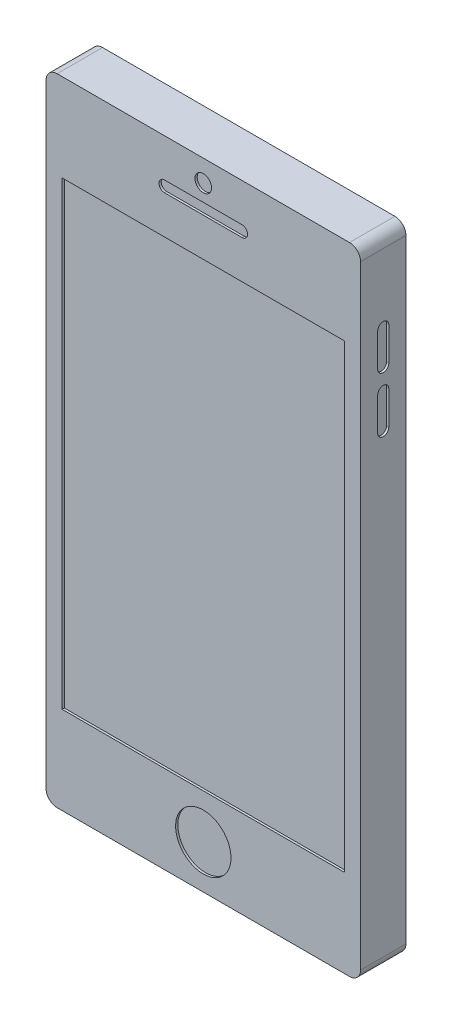
ISO-10303-21;
HEADER;
FILE_DESCRIPTION(('STEP AP214'),'2;1');
FILE_NAME('part.step','',(''),(''),'','','');
FILE_SCHEMA(('AUTOMOTIVE_DESIGN { 1 0 10303 214 1 1 1 1 }'));
ENDSEC;
DATA;
#1=APPLICATION_CONTEXT('core data for automotive mechanical design processes');
#2=APPLICATION_PROTOCOL_DEFINITION('international standard','automotive_design',2000,#1);
#3=PRODUCT_CONTEXT('',#1,'mechanical');
#4=PRODUCT('Part','Part','',(#3));
#5=PRODUCT_RELATED_PRODUCT_CATEGORY('part','',(#4));
#6=PRODUCT_DEFINITION_FORMATION('','',#4);
#7=PRODUCT_DEFINITION_CONTEXT('part definition',#1,'design');
#8=PRODUCT_DEFINITION('design','',#6,#7);
#9=PRODUCT_DEFINITION_SHAPE('','',#8);
#10=(LENGTH_UNIT() NAMED_UNIT(*) SI_UNIT(.MILLI.,.METRE.));
#11=(NAMED_UNIT(*) PLANE_ANGLE_UNIT() SI_UNIT($,.RADIAN.));
#12=(NAMED_UNIT(*) SI_UNIT($,.STERADIAN.) SOLID_ANGLE_UNIT());
#13=UNCERTAINTY_MEASURE_WITH_UNIT(LENGTH_MEASURE(1.E-05),#10,'distance_accuracy_value','');
#14=(GEOMETRIC_REPRESENTATION_CONTEXT(3) GLOBAL_UNCERTAINTY_ASSIGNED_CONTEXT((#13)) GLOBAL_UNIT_ASSIGNED_CONTEXT((#10,
#11,#12)) REPRESENTATION_CONTEXT('',''));
#15=CARTESIAN_POINT('',(0.,0.,0.));
#16=DIRECTION('',(0.,0.,1.));
#17=DIRECTION('',(1.,0.,0.));
#18=AXIS2_PLACEMENT_3D('',#15,#16,#17);
#19=CARTESIAN_POINT('',(36.068,72.898,5.20700000000001));
#20=DIRECTION('',(-1.,0.,0.));
#21=DIRECTION('',(0.,-1.,0.));
#22=AXIS2_PLACEMENT_3D('',#19,#20,#21);
#23=PLANE('',#22);
#24=DIRECTION('',(0.,-1.,0.));
#25=VECTOR('',#24,1.);
#26=CARTESIAN_POINT('',(36.068,54.61,1.27));
#27=LINE('',#26,#25);
#28=CARTESIAN_POINT('',(36.068,54.61,1.27));
#29=VERTEX_POINT('',#28);
#30=CARTESIAN_POINT('',(36.0680000000001,46.99,1.27));
#31=VERTEX_POINT('',#30);
#32=EDGE_CURVE('E238',#29,#31,#27,.T.);
#33=ORIENTED_EDGE('',*,*,#32,.F.);
#34=CARTESIAN_POINT('',(36.0680000000001,54.61,0.));
#35=DIRECTION('',(1.,0.,0.));
#36=DIRECTION('',(0.,1.,0.));
#37=AXIS2_PLACEMENT_3D('',#34,#35,#36);
#38=CIRCLE('',#37,1.27);
#39=CARTESIAN_POINT('',(36.0680000000001,54.61,-1.27));
#40=VERTEX_POINT('',#39);
#41=EDGE_CURVE('E64',#40,#29,#38,.T.);
#42=ORIENTED_EDGE('',*,*,#41,.F.);
#43=DIRECTION('',(0.,1.,0.));
#44=VECTOR('',#43,1.);
#45=CARTESIAN_POINT('',(36.0680000000001,54.61,-1.27));
#46=LINE('',#45,#44);
#47=CARTESIAN_POINT('',(36.0680000000001,46.99,-1.27));
#48=VERTEX_POINT('',#47);
#49=EDGE_CURVE('E229',#48,#40,#46,.T.);
#50=ORIENTED_EDGE('',*,*,#49,.F.);
#51=CARTESIAN_POINT('',(36.0680000000001,46.99,0.));
#52=DIRECTION('',(1.,0.,0.));
#53=DIRECTION('',(0.,1.,0.));
#54=AXIS2_PLACEMENT_3D('',#51,#52,#53);
#55=CIRCLE('',#54,1.27);
#56=EDGE_CURVE('E232',#31,#48,#55,.T.);
#57=ORIENTED_EDGE('',*,*,#56,.F.);
#58=EDGE_LOOP('',(#33,#42,#50,#57));
#59=FACE_BOUND('',#58,.T.);
#60=DIRECTION('',(0.,-1.,0.));
#61=VECTOR('',#60,1.);
#62=CARTESIAN_POINT('',(36.0680000000001,41.91,1.27));
#63=LINE('',#62,#61);
#64=CARTESIAN_POINT('',(36.0680000000001,41.91,1.27));
#65=VERTEX_POINT('',#64);
#66=CARTESIAN_POINT('',(36.0680000000001,34.29,1.27));
#67=VERTEX_POINT('',#66);
#68=EDGE_CURVE('E264',#65,#67,#63,.T.);
#69=ORIENTED_EDGE('',*,*,#68,.F.);
#70=CARTESIAN_POINT('',(36.0680000000001,41.91,0.));
#71=DIRECTION('',(1.,0.,0.));
#72=DIRECTION('',(0.,1.,0.));
#73=AXIS2_PLACEMENT_3D('',#70,#71,#72);
#74=CIRCLE('',#73,1.27);
#75=CARTESIAN_POINT('',(36.0680000000001,41.91,-1.27));
#76=VERTEX_POINT('',#75);
#77=EDGE_CURVE('E72',#76,#65,#74,.T.);
#78=ORIENTED_EDGE('',*,*,#77,.F.);
#79=DIRECTION('',(0.,1.,0.));
#80=VECTOR('',#79,1.);
#81=CARTESIAN_POINT('',(36.0680000000001,41.91,-1.27));
#82=LINE('',#81,#80);
#83=CARTESIAN_POINT('',(36.0680000000001,34.29,-1.27));
#84=VERTEX_POINT('',#83);
#85=EDGE_CURVE('E253',#84,#76,#82,.T.);
#86=ORIENTED_EDGE('',*,*,#85,.F.);
#87=CARTESIAN_POINT('',(36.0680000000001,34.29,0.));
#88=DIRECTION('',(1.,0.,0.));
#89=DIRECTION('',(0.,1.,0.));
#90=AXIS2_PLACEMENT_3D('',#87,#88,#89);
#91=CIRCLE('',#90,1.27);
#92=EDGE_CURVE('E267',#67,#84,#91,.T.);
#93=ORIENTED_EDGE('',*,*,#92,.F.);
#94=EDGE_LOOP('',(#69,#78,#86,#93));
#95=FACE_BOUND('',#94,.T.);
#96=DIRECTION('',(0.,1.,0.));
#97=VECTOR('',#96,1.);
#98=CARTESIAN_POINT('',(36.068,72.898,5.20700000000001));
#99=LINE('',#98,#97);
#100=CARTESIAN_POINT('',(36.068,-70.358,5.20700000000001));
#101=VERTEX_POINT('',#100);
#102=CARTESIAN_POINT('',(36.068,70.358,5.20700000000001));
#103=VERTEX_POINT('',#102);
#104=EDGE_CURVE('E360',#101,#103,#99,.T.);
#105=ORIENTED_EDGE('',*,*,#104,.F.);
#106=DIRECTION('',(0.,0.,-1.));
#107=VECTOR('',#106,1.);
#108=CARTESIAN_POINT('',(36.068,-70.358,5.20700000000001));
#109=LINE('',#108,#107);
#110=CARTESIAN_POINT('',(36.0680000000001,-70.358,-5.207));
#111=VERTEX_POINT('',#110);
#112=EDGE_CURVE('E411',#101,#111,#109,.T.);
#113=ORIENTED_EDGE('',*,*,#112,.T.);
#114=DIRECTION('',(0.,1.,0.));
#115=VECTOR('',#114,1.);
#116=CARTESIAN_POINT('',(36.0680000000001,72.898,-5.207));
#117=LINE('',#116,#115);
#118=CARTESIAN_POINT('',(36.0680000000001,70.358,-5.207));
#119=VERTEX_POINT('',#118);
#120=EDGE_CURVE('E353',#111,#119,#117,.T.);
#121=ORIENTED_EDGE('',*,*,#120,.T.);
#122=DIRECTION('',(0.,0.,-1.));
#123=VECTOR('',#122,1.);
#124=CARTESIAN_POINT('',(36.068,70.358,5.20700000000001));
#125=LINE('',#124,#123);
#126=EDGE_CURVE('E409',#119,#103,#125,.F.);
#127=ORIENTED_EDGE('',*,*,#126,.T.);
#128=EDGE_LOOP('',(#105,#113,#121,#127));
#129=FACE_BOUND('',#128,.T.);
#130=ADVANCED_FACE('F49',(#59,#95,#129),#23,.F.);
#131=CARTESIAN_POINT('',(-36.068,72.898,5.20700000000001));
#132=DIRECTION('',(0.,-1.,0.));
#133=DIRECTION('',(0.,0.,-1.));
#134=AXIS2_PLACEMENT_3D('',#131,#132,#133);
#135=PLANE('',#134);
#136=DIRECTION('',(-1.,0.,0.));
#137=VECTOR('',#136,1.);
#138=CARTESIAN_POINT('',(-36.068,72.898,-5.207));
#139=LINE('',#138,#137);
#140=CARTESIAN_POINT('',(33.528,72.898,-5.207));
#141=VERTEX_POINT('',#140);
#142=CARTESIAN_POINT('',(-33.528,72.898,-5.20700000000001));
#143=VERTEX_POINT('',#142);
#144=EDGE_CURVE('E376',#141,#143,#139,.T.);
#145=ORIENTED_EDGE('',*,*,#144,.T.);
#146=DIRECTION('',(0.,0.,-1.));
#147=VECTOR('',#146,1.);
#148=CARTESIAN_POINT('',(-33.528,72.898,5.20700000000001));
#149=LINE('',#148,#147);
#150=CARTESIAN_POINT('',(-33.528,72.898,5.20700000000001));
#151=VERTEX_POINT('',#150);
#152=EDGE_CURVE('E13',#143,#151,#149,.F.);
#153=ORIENTED_EDGE('',*,*,#152,.T.);
#154=DIRECTION('',(-1.,0.,0.));
#155=VECTOR('',#154,1.);
#156=CARTESIAN_POINT('',(-36.068,72.898,5.20700000000001));
#157=LINE('',#156,#155);
#158=CARTESIAN_POINT('',(33.528,72.898,5.20700000000001));
#159=VERTEX_POINT('',#158);
#160=EDGE_CURVE('E363',#159,#151,#157,.T.);
#161=ORIENTED_EDGE('',*,*,#160,.F.);
#162=DIRECTION('',(0.,0.,-1.));
#163=VECTOR('',#162,1.);
#164=CARTESIAN_POINT('',(33.528,72.898,5.20700000000001));
#165=LINE('',#164,#163);
#166=EDGE_CURVE('E57',#159,#141,#165,.T.);
#167=ORIENTED_EDGE('',*,*,#166,.T.);
#168=EDGE_LOOP('',(#145,#153,#161,#167));
#169=FACE_BOUND('',#168,.T.);
#170=ADVANCED_FACE('F418',(#169),#135,.F.);
#171=CARTESIAN_POINT('',(-36.068,72.898,5.20700000000001));
#172=DIRECTION('',(1.,0.,0.));
#173=DIRECTION('',(0.,1.,0.));
#174=AXIS2_PLACEMENT_3D('',#171,#172,#173);
#175=PLANE('',#174);
#176=DIRECTION('',(0.,-1.,0.));
#177=VECTOR('',#176,1.);
#178=CARTESIAN_POINT('',(-36.068,72.898,-5.207));
#179=LINE('',#178,#177);
#180=CARTESIAN_POINT('',(-36.068,70.358,-5.207));
#181=VERTEX_POINT('',#180);
#182=CARTESIAN_POINT('',(-36.068,-70.358,-5.207));
#183=VERTEX_POINT('',#182);
#184=EDGE_CURVE('E379',#181,#183,#179,.T.);
#185=ORIENTED_EDGE('',*,*,#184,.T.);
#186=DIRECTION('',(0.,0.,-1.));
#187=VECTOR('',#186,1.);
#188=CARTESIAN_POINT('',(-36.068,-70.358,5.20700000000001));
#189=LINE('',#188,#187);
#190=CARTESIAN_POINT('',(-36.068,-70.358,5.20700000000001));
#191=VERTEX_POINT('',#190);
#192=EDGE_CURVE('E399',#183,#191,#189,.F.);
#193=ORIENTED_EDGE('',*,*,#192,.T.);
#194=DIRECTION('',(0.,-1.,0.));
#195=VECTOR('',#194,1.);
#196=CARTESIAN_POINT('',(-36.068,72.898,5.20700000000001));
#197=LINE('',#196,#195);
#198=CARTESIAN_POINT('',(-36.068,70.358,5.20700000000001));
#199=VERTEX_POINT('',#198);
#200=EDGE_CURVE('E367',#199,#191,#197,.T.);
#201=ORIENTED_EDGE('',*,*,#200,.F.);
#202=DIRECTION('',(0.,0.,-1.));
#203=VECTOR('',#202,1.);
#204=CARTESIAN_POINT('',(-36.068,70.358,5.20700000000001));
#205=LINE('',#204,#203);
#206=EDGE_CURVE('E396',#199,#181,#205,.T.);
#207=ORIENTED_EDGE('',*,*,#206,.T.);
#208=EDGE_LOOP('',(#185,#193,#201,#207));
#209=FACE_BOUND('',#208,.T.);
#210=ADVANCED_FACE('F433',(#209),#175,.F.);
#211=CARTESIAN_POINT('',(-36.068,-72.898,5.20700000000001));
#212=DIRECTION('',(0.,1.,0.));
#213=DIRECTION('',(0.,0.,1.));
#214=AXIS2_PLACEMENT_3D('',#211,#212,#213);
#215=PLANE('',#214);
#216=DIRECTION('',(1.,0.,0.));
#217=VECTOR('',#216,1.);
#218=CARTESIAN_POINT('',(-36.068,-72.898,5.20700000000001));
#219=LINE('',#218,#217);
#220=CARTESIAN_POINT('',(-33.528,-72.898,5.20700000000001));
#221=VERTEX_POINT('',#220);
#222=CARTESIAN_POINT('',(33.528,-72.898,5.20700000000001));
#223=VERTEX_POINT('',#222);
#224=EDGE_CURVE('E370',#221,#223,#219,.T.);
#225=ORIENTED_EDGE('',*,*,#224,.F.);
#226=DIRECTION('',(0.,0.,-1.));
#227=VECTOR('',#226,1.);
#228=CARTESIAN_POINT('',(-33.528,-72.898,5.20700000000001));
#229=LINE('',#228,#227);
#230=CARTESIAN_POINT('',(-33.528,-72.898,-5.207));
#231=VERTEX_POINT('',#230);
#232=EDGE_CURVE('E385',#221,#231,#229,.T.);
#233=ORIENTED_EDGE('',*,*,#232,.T.);
#234=DIRECTION('',(1.,0.,0.));
#235=VECTOR('',#234,1.);
#236=CARTESIAN_POINT('',(-36.068,-72.898,-5.207));
#237=LINE('',#236,#235);
#238=CARTESIAN_POINT('',(33.5280000000001,-72.898,-5.207));
#239=VERTEX_POINT('',#238);
#240=EDGE_CURVE('E364',#231,#239,#237,.T.);
#241=ORIENTED_EDGE('',*,*,#240,.T.);
#242=DIRECTION('',(0.,0.,-1.));
#243=VECTOR('',#242,1.);
#244=CARTESIAN_POINT('',(33.528,-72.898,5.20700000000001));
#245=LINE('',#244,#243);
#246=EDGE_CURVE('E373',#239,#223,#245,.F.);
#247=ORIENTED_EDGE('',*,*,#246,.T.);
#248=EDGE_LOOP('',(#225,#233,#241,#247));
#249=FACE_BOUND('',#248,.T.);
#250=ADVANCED_FACE('F443',(#249),#215,.F.);
#251=CARTESIAN_POINT('',(0.,0.,5.20700000000001));
#252=DIRECTION('',(0.,0.,1.));
#253=DIRECTION('',(1.,0.,0.));
#254=AXIS2_PLACEMENT_3D('',#251,#252,#253);
#255=PLANE('',#254);
#256=CARTESIAN_POINT('',(0.,67.9203878548885,5.20700000000001));
#257=DIRECTION('',(0.,0.,1.));
#258=DIRECTION('',(1.,0.,0.));
#259=AXIS2_PLACEMENT_3D('',#256,#257,#258);
#260=CIRCLE('',#259,1.905);
#261=CARTESIAN_POINT('',(1.905,67.9203878548885,5.20700000000001));
#262=VERTEX_POINT('',#261);
#263=EDGE_CURVE('E281',#262,#262,#260,.T.);
#264=ORIENTED_EDGE('',*,*,#263,.F.);
#265=EDGE_LOOP('',(#264));
#266=FACE_BOUND('',#265,.T.);
#267=CARTESIAN_POINT('',(-8.89,62.8403878548885,5.20700000000001));
#268=DIRECTION('',(0.,0.,1.));
#269=DIRECTION('',(1.,0.,0.));
#270=AXIS2_PLACEMENT_3D('',#267,#268,#269);
#271=CIRCLE('',#270,1.26999999999999);
#272=CARTESIAN_POINT('',(-8.89,64.1103878548885,5.20700000000001));
#273=VERTEX_POINT('',#272);
#274=CARTESIAN_POINT('',(-8.89,61.5703878548885,5.20700000000001));
#275=VERTEX_POINT('',#274);
#276=EDGE_CURVE('E306',#273,#275,#271,.T.);
#277=ORIENTED_EDGE('',*,*,#276,.F.);
#278=DIRECTION('',(-1.,0.,0.));
#279=VECTOR('',#278,1.);
#280=CARTESIAN_POINT('',(-8.89,64.1103878548885,5.20700000000001));
#281=LINE('',#280,#279);
#282=CARTESIAN_POINT('',(8.89000000000001,64.1103878548885,5.20700000000001));
#283=VERTEX_POINT('',#282);
#284=EDGE_CURVE('E296',#283,#273,#281,.T.);
#285=ORIENTED_EDGE('',*,*,#284,.F.);
#286=CARTESIAN_POINT('',(8.89000000000001,62.8403878548885,5.20700000000001));
#287=DIRECTION('',(0.,0.,1.));
#288=DIRECTION('',(1.,0.,0.));
#289=AXIS2_PLACEMENT_3D('',#286,#287,#288);
#290=CIRCLE('',#289,1.26999999999999);
#291=CARTESIAN_POINT('',(8.89000000000001,61.5703878548885,5.20700000000001));
#292=VERTEX_POINT('',#291);
#293=EDGE_CURVE('E312',#292,#283,#290,.T.);
#294=ORIENTED_EDGE('',*,*,#293,.F.);
#295=DIRECTION('',(1.,0.,0.));
#296=VECTOR('',#295,1.);
#297=CARTESIAN_POINT('',(-8.89,61.5703878548885,5.20700000000001));
#298=LINE('',#297,#296);
#299=EDGE_CURVE('E308',#275,#292,#298,.T.);
#300=ORIENTED_EDGE('',*,*,#299,.F.);
#301=EDGE_LOOP('',(#277,#285,#294,#300));
#302=FACE_BOUND('',#301,.T.);
#303=CARTESIAN_POINT('',(0.,-62.9427757097769,5.20700000000001));
#304=DIRECTION('',(0.,0.,1.));
#305=DIRECTION('',(1.,0.,0.));
#306=AXIS2_PLACEMENT_3D('',#303,#304,#305);
#307=CIRCLE('',#306,6.35);
#308=CARTESIAN_POINT('',(6.35000000000002,-62.9427757097769,5.20700000000001));
#309=VERTEX_POINT('',#308);
#310=EDGE_CURVE('E288',#309,#309,#307,.T.);
#311=ORIENTED_EDGE('',*,*,#310,.F.);
#312=EDGE_LOOP('',(#311));
#313=FACE_BOUND('',#312,.T.);
#314=DIRECTION('',(0.,1.,0.));
#315=VECTOR('',#314,1.);
#316=CARTESIAN_POINT('',(32.385,-52.7827757097769,5.20700000000001));
#317=LINE('',#316,#315);
#318=CARTESIAN_POINT('',(32.385,-52.7827757097769,5.20700000000001));
#319=VERTEX_POINT('',#318);
#320=CARTESIAN_POINT('',(32.385,52.7827757097769,5.20700000000001));
#321=VERTEX_POINT('',#320);
#322=EDGE_CURVE('E287',#319,#321,#317,.T.);
#323=ORIENTED_EDGE('',*,*,#322,.F.);
#324=DIRECTION('',(1.,0.,0.));
#325=VECTOR('',#324,1.);
#326=CARTESIAN_POINT('',(-32.385,-52.7827757097769,5.20700000000001));
#327=LINE('',#326,#325);
#328=CARTESIAN_POINT('',(-32.385,-52.7827757097769,5.20700000000001));
#329=VERTEX_POINT('',#328);
#330=EDGE_CURVE('E332',#329,#319,#327,.T.);
#331=ORIENTED_EDGE('',*,*,#330,.F.);
#332=DIRECTION('',(0.,-1.,0.));
#333=VECTOR('',#332,1.);
#334=CARTESIAN_POINT('',(-32.385,-52.7827757097769,5.20700000000001));
#335=LINE('',#334,#333);
#336=CARTESIAN_POINT('',(-32.385,52.7827757097769,5.20700000000001));
#337=VERTEX_POINT('',#336);
#338=EDGE_CURVE('E346',#337,#329,#335,.T.);
#339=ORIENTED_EDGE('',*,*,#338,.F.);
#340=DIRECTION('',(-1.,0.,0.));
#341=VECTOR('',#340,1.);
#342=CARTESIAN_POINT('',(-32.385,52.7827757097769,5.20700000000001));
#343=LINE('',#342,#341);
#344=EDGE_CURVE('E343',#321,#337,#343,.T.);
#345=ORIENTED_EDGE('',*,*,#344,.F.);
#346=EDGE_LOOP('',(#323,#331,#339,#345));
#347=FACE_BOUND('',#346,.T.);
#348=ORIENTED_EDGE('',*,*,#200,.T.);
#349=CARTESIAN_POINT('',(-33.528,-70.358,5.20700000000001));
#350=DIRECTION('',(0.,0.,1.));
#351=DIRECTION('',(1.,0.,0.));
#352=AXIS2_PLACEMENT_3D('',#349,#350,#351);
#353=CIRCLE('',#352,2.54);
#354=EDGE_CURVE('E407',#191,#221,#353,.T.);
#355=ORIENTED_EDGE('',*,*,#354,.T.);
#356=ORIENTED_EDGE('',*,*,#224,.T.);
#357=CARTESIAN_POINT('',(33.528,-70.358,5.20700000000001));
#358=DIRECTION('',(0.,0.,1.));
#359=DIRECTION('',(1.,0.,0.));
#360=AXIS2_PLACEMENT_3D('',#357,#358,#359);
#361=CIRCLE('',#360,2.54);
#362=EDGE_CURVE('E405',#223,#101,#361,.T.);
#363=ORIENTED_EDGE('',*,*,#362,.T.);
#364=ORIENTED_EDGE('',*,*,#104,.T.);
#365=CARTESIAN_POINT('',(33.528,70.358,5.20700000000001));
#366=DIRECTION('',(0.,0.,1.));
#367=DIRECTION('',(1.,0.,0.));
#368=AXIS2_PLACEMENT_3D('',#365,#366,#367);
#369=CIRCLE('',#368,2.54);
#370=EDGE_CURVE('E401',#103,#159,#369,.T.);
#371=ORIENTED_EDGE('',*,*,#370,.T.);
#372=ORIENTED_EDGE('',*,*,#160,.T.);
#373=CARTESIAN_POINT('',(-33.528,70.358,5.20700000000001));
#374=DIRECTION('',(0.,0.,1.));
#375=DIRECTION('',(1.,0.,0.));
#376=AXIS2_PLACEMENT_3D('',#373,#374,#375);
#377=CIRCLE('',#376,2.54);
#378=EDGE_CURVE('E403',#151,#199,#377,.T.);
#379=ORIENTED_EDGE('',*,*,#378,.T.);
#380=EDGE_LOOP('',(#348,#355,#356,#363,#364,#371,#372,#379));
#381=FACE_BOUND('',#380,.T.);
#382=ADVANCED_FACE('F437',(#266,#302,#313,#347,#381),#255,.T.);
#383=CARTESIAN_POINT('',(0.,0.,-5.207));
#384=DIRECTION('',(0.,0.,1.));
#385=DIRECTION('',(1.,0.,0.));
#386=AXIS2_PLACEMENT_3D('',#383,#384,#385);
#387=PLANE('',#386);
#388=CARTESIAN_POINT('',(-25.4,63.5,-5.207));
#389=DIRECTION('',(0.,0.,-1.));
#390=DIRECTION('',(-1.,0.,0.));
#391=AXIS2_PLACEMENT_3D('',#388,#389,#390);
#392=CIRCLE('',#391,3.81);
#393=CARTESIAN_POINT('',(-29.21,63.5,-5.207));
#394=VERTEX_POINT('',#393);
#395=EDGE_CURVE('E245',#394,#394,#392,.T.);
#396=ORIENTED_EDGE('',*,*,#395,.F.);
#397=EDGE_LOOP('',(#396));
#398=FACE_BOUND('',#397,.T.);
#399=ORIENTED_EDGE('',*,*,#240,.F.);
#400=CARTESIAN_POINT('',(-33.528,-70.358,-5.207));
#401=DIRECTION('',(0.,0.,1.));
#402=DIRECTION('',(1.,0.,0.));
#403=AXIS2_PLACEMENT_3D('',#400,#401,#402);
#404=CIRCLE('',#403,2.54);
#405=EDGE_CURVE('E394',#231,#183,#404,.F.);
#406=ORIENTED_EDGE('',*,*,#405,.T.);
#407=ORIENTED_EDGE('',*,*,#184,.F.);
#408=CARTESIAN_POINT('',(-33.528,70.358,-5.207));
#409=DIRECTION('',(0.,0.,1.));
#410=DIRECTION('',(1.,0.,0.));
#411=AXIS2_PLACEMENT_3D('',#408,#409,#410);
#412=CIRCLE('',#411,2.54);
#413=EDGE_CURVE('E390',#181,#143,#412,.F.);
#414=ORIENTED_EDGE('',*,*,#413,.T.);
#415=ORIENTED_EDGE('',*,*,#144,.F.);
#416=CARTESIAN_POINT('',(33.528,70.358,-5.207));
#417=DIRECTION('',(0.,0.,1.));
#418=DIRECTION('',(1.,0.,0.));
#419=AXIS2_PLACEMENT_3D('',#416,#417,#418);
#420=CIRCLE('',#419,2.54);
#421=EDGE_CURVE('E388',#141,#119,#420,.F.);
#422=ORIENTED_EDGE('',*,*,#421,.T.);
#423=ORIENTED_EDGE('',*,*,#120,.F.);
#424=CARTESIAN_POINT('',(33.5280000000001,-70.358,-5.207));
#425=DIRECTION('',(0.,0.,1.));
#426=DIRECTION('',(1.,0.,0.));
#427=AXIS2_PLACEMENT_3D('',#424,#425,#426);
#428=CIRCLE('',#427,2.54);
#429=EDGE_CURVE('E392',#111,#239,#428,.F.);
#430=ORIENTED_EDGE('',*,*,#429,.T.);
#431=EDGE_LOOP('',(#399,#406,#407,#414,#415,#422,#423,#430));
#432=FACE_BOUND('',#431,.T.);
#433=ADVANCED_FACE('F424',(#398,#432),#387,.F.);
#434=CARTESIAN_POINT('',(-33.528,-70.358,5.20700000000001));
#435=DIRECTION('',(0.,0.,-1.));
#436=DIRECTION('',(-1.,0.,0.));
#437=AXIS2_PLACEMENT_3D('',#434,#435,#436);
#438=CYLINDRICAL_SURFACE('',#437,2.54);
#439=ORIENTED_EDGE('',*,*,#354,.F.);
#440=ORIENTED_EDGE('',*,*,#192,.F.);
#441=ORIENTED_EDGE('',*,*,#405,.F.);
#442=ORIENTED_EDGE('',*,*,#232,.F.);
#443=EDGE_LOOP('',(#439,#440,#441,#442));
#444=FACE_BOUND('',#443,.T.);
#445=ADVANCED_FACE('F441',(#444),#438,.T.);
#446=CARTESIAN_POINT('',(33.528,-70.358,5.20700000000001));
#447=DIRECTION('',(0.,0.,-1.));
#448=DIRECTION('',(-1.,0.,0.));
#449=AXIS2_PLACEMENT_3D('',#446,#447,#448);
#450=CYLINDRICAL_SURFACE('',#449,2.54);
#451=ORIENTED_EDGE('',*,*,#362,.F.);
#452=ORIENTED_EDGE('',*,*,#246,.F.);
#453=ORIENTED_EDGE('',*,*,#429,.F.);
#454=ORIENTED_EDGE('',*,*,#112,.F.);
#455=EDGE_LOOP('',(#451,#452,#453,#454));
#456=FACE_BOUND('',#455,.T.);
#457=ADVANCED_FACE('F448',(#456),#450,.T.);
#458=CARTESIAN_POINT('',(-33.528,70.358,5.20700000000001));
#459=DIRECTION('',(0.,0.,-1.));
#460=DIRECTION('',(-1.,0.,0.));
#461=AXIS2_PLACEMENT_3D('',#458,#459,#460);
#462=CYLINDRICAL_SURFACE('',#461,2.54);
#463=ORIENTED_EDGE('',*,*,#378,.F.);
#464=ORIENTED_EDGE('',*,*,#152,.F.);
#465=ORIENTED_EDGE('',*,*,#413,.F.);
#466=ORIENTED_EDGE('',*,*,#206,.F.);
#467=EDGE_LOOP('',(#463,#464,#465,#466));
#468=FACE_BOUND('',#467,.T.);
#469=ADVANCED_FACE('F430',(#468),#462,.T.);
#470=CARTESIAN_POINT('',(33.528,70.358,5.20700000000001));
#471=DIRECTION('',(0.,0.,-1.));
#472=DIRECTION('',(-1.,0.,0.));
#473=AXIS2_PLACEMENT_3D('',#470,#471,#472);
#474=CYLINDRICAL_SURFACE('',#473,2.54);
#475=ORIENTED_EDGE('',*,*,#370,.F.);
#476=ORIENTED_EDGE('',*,*,#126,.F.);
#477=ORIENTED_EDGE('',*,*,#421,.F.);
#478=ORIENTED_EDGE('',*,*,#166,.F.);
#479=EDGE_LOOP('',(#475,#476,#477,#478));
#480=FACE_BOUND('',#479,.T.);
#481=ADVANCED_FACE('F51',(#480),#474,.T.);
#482=CARTESIAN_POINT('',(32.385,-52.7827757097769,4.69900000000001));
#483=DIRECTION('',(1.,0.,0.));
#484=DIRECTION('',(0.,0.,-1.));
#485=AXIS2_PLACEMENT_3D('',#482,#483,#484);
#486=PLANE('',#485);
#487=ORIENTED_EDGE('',*,*,#322,.T.);
#488=DIRECTION('',(0.,0.,1.));
#489=VECTOR('',#488,1.);
#490=CARTESIAN_POINT('',(32.385,52.7827757097769,4.69900000000001));
#491=LINE('',#490,#489);
#492=CARTESIAN_POINT('',(32.385,52.7827757097769,4.69900000000001));
#493=VERTEX_POINT('',#492);
#494=EDGE_CURVE('E341',#493,#321,#491,.T.);
#495=ORIENTED_EDGE('',*,*,#494,.F.);
#496=DIRECTION('',(0.,1.,0.));
#497=VECTOR('',#496,1.);
#498=CARTESIAN_POINT('',(32.385,-52.7827757097769,4.69900000000001));
#499=LINE('',#498,#497);
#500=CARTESIAN_POINT('',(32.385,-52.7827757097769,4.69900000000001));
#501=VERTEX_POINT('',#500);
#502=EDGE_CURVE('E328',#501,#493,#499,.T.);
#503=ORIENTED_EDGE('',*,*,#502,.F.);
#504=DIRECTION('',(0.,0.,1.));
#505=VECTOR('',#504,1.);
#506=CARTESIAN_POINT('',(32.385,-52.7827757097769,4.69900000000001));
#507=LINE('',#506,#505);
#508=EDGE_CURVE('E351',#501,#319,#507,.T.);
#509=ORIENTED_EDGE('',*,*,#508,.T.);
#510=EDGE_LOOP('',(#487,#495,#503,#509));
#511=FACE_BOUND('',#510,.T.);
#512=ADVANCED_FACE('F453',(#511),#486,.F.);
#513=CARTESIAN_POINT('',(-32.385,-52.7827757097769,4.69900000000001));
#514=DIRECTION('',(0.,-1.,0.));
#515=DIRECTION('',(0.,0.,-1.));
#516=AXIS2_PLACEMENT_3D('',#513,#514,#515);
#517=PLANE('',#516);
#518=ORIENTED_EDGE('',*,*,#330,.T.);
#519=ORIENTED_EDGE('',*,*,#508,.F.);
#520=DIRECTION('',(1.,0.,0.));
#521=VECTOR('',#520,1.);
#522=CARTESIAN_POINT('',(-32.385,-52.7827757097769,4.69900000000001));
#523=LINE('',#522,#521);
#524=CARTESIAN_POINT('',(-32.385,-52.7827757097769,4.69900000000001));
#525=VERTEX_POINT('',#524);
#526=EDGE_CURVE('E338',#525,#501,#523,.T.);
#527=ORIENTED_EDGE('',*,*,#526,.F.);
#528=DIRECTION('',(0.,0.,1.));
#529=VECTOR('',#528,1.);
#530=CARTESIAN_POINT('',(-32.385,-52.7827757097769,4.69900000000001));
#531=LINE('',#530,#529);
#532=EDGE_CURVE('E354',#525,#329,#531,.T.);
#533=ORIENTED_EDGE('',*,*,#532,.T.);
#534=EDGE_LOOP('',(#518,#519,#527,#533));
#535=FACE_BOUND('',#534,.T.);
#536=ADVANCED_FACE('F458',(#535),#517,.F.);
#537=CARTESIAN_POINT('',(-32.385,-52.7827757097769,4.69900000000001));
#538=DIRECTION('',(-1.,0.,0.));
#539=DIRECTION('',(0.,0.,1.));
#540=AXIS2_PLACEMENT_3D('',#537,#538,#539);
#541=PLANE('',#540);
#542=ORIENTED_EDGE('',*,*,#338,.T.);
#543=ORIENTED_EDGE('',*,*,#532,.F.);
#544=DIRECTION('',(0.,-1.,0.));
#545=VECTOR('',#544,1.);
#546=CARTESIAN_POINT('',(-32.385,-52.7827757097769,4.69900000000001));
#547=LINE('',#546,#545);
#548=CARTESIAN_POINT('',(-32.385,52.7827757097769,4.69900000000001));
#549=VERTEX_POINT('',#548);
#550=EDGE_CURVE('E335',#549,#525,#547,.T.);
#551=ORIENTED_EDGE('',*,*,#550,.F.);
#552=DIRECTION('',(0.,0.,1.));
#553=VECTOR('',#552,1.);
#554=CARTESIAN_POINT('',(-32.385,52.7827757097769,4.69900000000001));
#555=LINE('',#554,#553);
#556=EDGE_CURVE('E356',#549,#337,#555,.T.);
#557=ORIENTED_EDGE('',*,*,#556,.T.);
#558=EDGE_LOOP('',(#542,#543,#551,#557));
#559=FACE_BOUND('',#558,.T.);
#560=ADVANCED_FACE('F496',(#559),#541,.F.);
#561=CARTESIAN_POINT('',(-32.385,52.7827757097769,4.69900000000001));
#562=DIRECTION('',(0.,1.,0.));
#563=DIRECTION('',(0.,0.,1.));
#564=AXIS2_PLACEMENT_3D('',#561,#562,#563);
#565=PLANE('',#564);
#566=ORIENTED_EDGE('',*,*,#344,.T.);
#567=ORIENTED_EDGE('',*,*,#556,.F.);
#568=DIRECTION('',(-1.,0.,0.));
#569=VECTOR('',#568,1.);
#570=CARTESIAN_POINT('',(-32.385,52.7827757097769,4.69900000000001));
#571=LINE('',#570,#569);
#572=EDGE_CURVE('E331',#493,#549,#571,.T.);
#573=ORIENTED_EDGE('',*,*,#572,.F.);
#574=ORIENTED_EDGE('',*,*,#494,.T.);
#575=EDGE_LOOP('',(#566,#567,#573,#574));
#576=FACE_BOUND('',#575,.T.);
#577=ADVANCED_FACE('F504',(#576),#565,.F.);
#578=CARTESIAN_POINT('',(0.,0.,4.69900000000001));
#579=DIRECTION('',(0.,0.,-1.));
#580=DIRECTION('',(-1.,0.,0.));
#581=AXIS2_PLACEMENT_3D('',#578,#579,#580);
#582=PLANE('',#581);
#583=ORIENTED_EDGE('',*,*,#502,.T.);
#584=ORIENTED_EDGE('',*,*,#572,.T.);
#585=ORIENTED_EDGE('',*,*,#550,.T.);
#586=ORIENTED_EDGE('',*,*,#526,.T.);
#587=EDGE_LOOP('',(#583,#584,#585,#586));
#588=FACE_BOUND('',#587,.T.);
#589=ADVANCED_FACE('F512',(#588),#582,.F.);
#590=CARTESIAN_POINT('',(0.,-62.9427757097769,4.69900000000001));
#591=DIRECTION('',(0.,0.,1.));
#592=DIRECTION('',(1.,0.,0.));
#593=AXIS2_PLACEMENT_3D('',#590,#591,#592);
#594=CYLINDRICAL_SURFACE('',#593,6.35);
#595=CARTESIAN_POINT('',(0.,-62.9427757097769,4.69900000000001));
#596=DIRECTION('',(0.,0.,1.));
#597=DIRECTION('',(1.,0.,0.));
#598=AXIS2_PLACEMENT_3D('',#595,#596,#597);
#599=CIRCLE('',#598,6.35);
#600=CARTESIAN_POINT('',(6.35000000000002,-62.9427757097769,4.69900000000001));
#601=VERTEX_POINT('',#600);
#602=EDGE_CURVE('E284',#601,#601,#599,.T.);
#603=ORIENTED_EDGE('',*,*,#602,.F.);
#604=EDGE_LOOP('',(#603));
#605=FACE_BOUND('',#604,.T.);
#606=ORIENTED_EDGE('',*,*,#310,.T.);
#607=EDGE_LOOP('',(#606));
#608=FACE_BOUND('',#607,.T.);
#609=ADVANCED_FACE('F520',(#605,#608),#594,.F.);
#610=CARTESIAN_POINT('',(0.,-62.9427757097769,4.69900000000001));
#611=DIRECTION('',(0.,0.,1.));
#612=DIRECTION('',(1.,0.,0.));
#613=AXIS2_PLACEMENT_3D('',#610,#611,#612);
#614=PLANE('',#613);
#615=ORIENTED_EDGE('',*,*,#602,.T.);
#616=EDGE_LOOP('',(#615));
#617=FACE_BOUND('',#616,.T.);
#618=ADVANCED_FACE('F528',(#617),#614,.T.);
#619=CARTESIAN_POINT('',(-8.89,62.8403878548885,4.69900000000001));
#620=DIRECTION('',(0.,0.,1.));
#621=DIRECTION('',(1.,0.,0.));
#622=AXIS2_PLACEMENT_3D('',#619,#620,#621);
#623=CYLINDRICAL_SURFACE('',#622,1.26999999999999);
#624=ORIENTED_EDGE('',*,*,#276,.T.);
#625=DIRECTION('',(0.,0.,1.));
#626=VECTOR('',#625,1.);
#627=CARTESIAN_POINT('',(-8.89,61.5703878548885,4.69900000000001));
#628=LINE('',#627,#626);
#629=CARTESIAN_POINT('',(-8.89,61.5703878548885,4.69900000000001));
#630=VERTEX_POINT('',#629);
#631=EDGE_CURVE('E305',#630,#275,#628,.T.);
#632=ORIENTED_EDGE('',*,*,#631,.F.);
#633=CARTESIAN_POINT('',(-8.89,62.8403878548885,4.69900000000001));
#634=DIRECTION('',(0.,0.,1.));
#635=DIRECTION('',(1.,0.,0.));
#636=AXIS2_PLACEMENT_3D('',#633,#634,#635);
#637=CIRCLE('',#636,1.26999999999999);
#638=CARTESIAN_POINT('',(-8.89,64.1103878548885,4.69900000000001));
#639=VERTEX_POINT('',#638);
#640=EDGE_CURVE('E292',#639,#630,#637,.T.);
#641=ORIENTED_EDGE('',*,*,#640,.F.);
#642=DIRECTION('',(0.,0.,1.));
#643=VECTOR('',#642,1.);
#644=CARTESIAN_POINT('',(-8.89,64.1103878548885,4.69900000000001));
#645=LINE('',#644,#643);
#646=EDGE_CURVE('E291',#639,#273,#645,.T.);
#647=ORIENTED_EDGE('',*,*,#646,.T.);
#648=EDGE_LOOP('',(#624,#632,#641,#647));
#649=FACE_BOUND('',#648,.T.);
#650=ADVANCED_FACE('F536',(#649),#623,.F.);
#651=CARTESIAN_POINT('',(-8.89,64.1103878548885,4.69900000000001));
#652=DIRECTION('',(0.,1.,0.));
#653=DIRECTION('',(0.,0.,1.));
#654=AXIS2_PLACEMENT_3D('',#651,#652,#653);
#655=PLANE('',#654);
#656=ORIENTED_EDGE('',*,*,#284,.T.);
#657=ORIENTED_EDGE('',*,*,#646,.F.);
#658=DIRECTION('',(-1.,0.,0.));
#659=VECTOR('',#658,1.);
#660=CARTESIAN_POINT('',(-8.89,64.1103878548885,4.69900000000001));
#661=LINE('',#660,#659);
#662=CARTESIAN_POINT('',(8.89000000000001,64.1103878548885,4.69900000000001));
#663=VERTEX_POINT('',#662);
#664=EDGE_CURVE('E302',#663,#639,#661,.T.);
#665=ORIENTED_EDGE('',*,*,#664,.F.);
#666=DIRECTION('',(0.,0.,1.));
#667=VECTOR('',#666,1.);
#668=CARTESIAN_POINT('',(8.89000000000001,64.1103878548885,4.69900000000001));
#669=LINE('',#668,#667);
#670=EDGE_CURVE('E318',#663,#283,#669,.T.);
#671=ORIENTED_EDGE('',*,*,#670,.T.);
#672=EDGE_LOOP('',(#656,#657,#665,#671));
#673=FACE_BOUND('',#672,.T.);
#674=ADVANCED_FACE('F544',(#673),#655,.F.);
#675=CARTESIAN_POINT('',(8.89000000000001,62.8403878548885,4.69900000000001));
#676=DIRECTION('',(0.,0.,1.));
#677=DIRECTION('',(1.,0.,0.));
#678=AXIS2_PLACEMENT_3D('',#675,#676,#677);
#679=CYLINDRICAL_SURFACE('',#678,1.26999999999999);
#680=ORIENTED_EDGE('',*,*,#293,.T.);
#681=ORIENTED_EDGE('',*,*,#670,.F.);
#682=CARTESIAN_POINT('',(8.89000000000001,62.8403878548885,4.69900000000001));
#683=DIRECTION('',(0.,0.,1.));
#684=DIRECTION('',(1.,0.,0.));
#685=AXIS2_PLACEMENT_3D('',#682,#683,#684);
#686=CIRCLE('',#685,1.26999999999999);
#687=CARTESIAN_POINT('',(8.89000000000001,61.5703878548885,4.69900000000001));
#688=VERTEX_POINT('',#687);
#689=EDGE_CURVE('E299',#688,#663,#686,.T.);
#690=ORIENTED_EDGE('',*,*,#689,.F.);
#691=DIRECTION('',(0.,0.,1.));
#692=VECTOR('',#691,1.);
#693=CARTESIAN_POINT('',(8.89000000000001,61.5703878548885,4.69900000000001));
#694=LINE('',#693,#692);
#695=EDGE_CURVE('E320',#688,#292,#694,.T.);
#696=ORIENTED_EDGE('',*,*,#695,.T.);
#697=EDGE_LOOP('',(#680,#681,#690,#696));
#698=FACE_BOUND('',#697,.T.);
#699=ADVANCED_FACE('F552',(#698),#679,.F.);
#700=CARTESIAN_POINT('',(-8.89,61.5703878548885,4.69900000000001));
#701=DIRECTION('',(0.,-1.,0.));
#702=DIRECTION('',(0.,0.,-1.));
#703=AXIS2_PLACEMENT_3D('',#700,#701,#702);
#704=PLANE('',#703);
#705=ORIENTED_EDGE('',*,*,#299,.T.);
#706=ORIENTED_EDGE('',*,*,#695,.F.);
#707=DIRECTION('',(1.,0.,0.));
#708=VECTOR('',#707,1.);
#709=CARTESIAN_POINT('',(-8.89,61.5703878548885,4.69900000000001));
#710=LINE('',#709,#708);
#711=EDGE_CURVE('E295',#630,#688,#710,.T.);
#712=ORIENTED_EDGE('',*,*,#711,.F.);
#713=ORIENTED_EDGE('',*,*,#631,.T.);
#714=EDGE_LOOP('',(#705,#706,#712,#713));
#715=FACE_BOUND('',#714,.T.);
#716=ADVANCED_FACE('F560',(#715),#704,.F.);
#717=CARTESIAN_POINT('',(-8.89,62.8403878548885,4.69900000000001));
#718=DIRECTION('',(0.,0.,1.));
#719=DIRECTION('',(1.,0.,0.));
#720=AXIS2_PLACEMENT_3D('',#717,#718,#719);
#721=PLANE('',#720);
#722=ORIENTED_EDGE('',*,*,#640,.T.);
#723=ORIENTED_EDGE('',*,*,#711,.T.);
#724=ORIENTED_EDGE('',*,*,#689,.T.);
#725=ORIENTED_EDGE('',*,*,#664,.T.);
#726=EDGE_LOOP('',(#722,#723,#724,#725));
#727=FACE_BOUND('',#726,.T.);
#728=ADVANCED_FACE('F568',(#727),#721,.T.);
#729=CARTESIAN_POINT('',(0.,67.9203878548885,4.69900000000001));
#730=DIRECTION('',(0.,0.,1.));
#731=DIRECTION('',(1.,0.,0.));
#732=AXIS2_PLACEMENT_3D('',#729,#730,#731);
#733=CYLINDRICAL_SURFACE('',#732,1.905);
#734=CARTESIAN_POINT('',(0.,67.9203878548885,4.69900000000001));
#735=DIRECTION('',(0.,0.,1.));
#736=DIRECTION('',(1.,0.,0.));
#737=AXIS2_PLACEMENT_3D('',#734,#735,#736);
#738=CIRCLE('',#737,1.905);
#739=CARTESIAN_POINT('',(1.905,67.9203878548885,4.69900000000001));
#740=VERTEX_POINT('',#739);
#741=EDGE_CURVE('E309',#740,#740,#738,.T.);
#742=ORIENTED_EDGE('',*,*,#741,.F.);
#743=EDGE_LOOP('',(#742));
#744=FACE_BOUND('',#743,.T.);
#745=ORIENTED_EDGE('',*,*,#263,.T.);
#746=EDGE_LOOP('',(#745));
#747=FACE_BOUND('',#746,.T.);
#748=ADVANCED_FACE('F576',(#744,#747),#733,.F.);
#749=CARTESIAN_POINT('',(0.,67.9203878548885,4.69900000000001));
#750=DIRECTION('',(0.,0.,1.));
#751=DIRECTION('',(1.,0.,0.));
#752=AXIS2_PLACEMENT_3D('',#749,#750,#751);
#753=PLANE('',#752);
#754=ORIENTED_EDGE('',*,*,#741,.T.);
#755=EDGE_LOOP('',(#754));
#756=FACE_BOUND('',#755,.T.);
#757=ADVANCED_FACE('F584',(#756),#753,.T.);
#758=CARTESIAN_POINT('',(-25.4,63.5,-4.699));
#759=DIRECTION('',(0.,0.,-1.));
#760=DIRECTION('',(-1.,0.,0.));
#761=AXIS2_PLACEMENT_3D('',#758,#759,#760);
#762=CYLINDRICAL_SURFACE('',#761,3.81);
#763=CARTESIAN_POINT('',(-25.4,63.5,-4.699));
#764=DIRECTION('',(0.,0.,-1.));
#765=DIRECTION('',(-1.,0.,0.));
#766=AXIS2_PLACEMENT_3D('',#763,#764,#765);
#767=CIRCLE('',#766,3.81);
#768=CARTESIAN_POINT('',(-29.21,63.5,-4.699));
#769=VERTEX_POINT('',#768);
#770=EDGE_CURVE('E278',#769,#769,#767,.T.);
#771=ORIENTED_EDGE('',*,*,#770,.F.);
#772=EDGE_LOOP('',(#771));
#773=FACE_BOUND('',#772,.T.);
#774=ORIENTED_EDGE('',*,*,#395,.T.);
#775=EDGE_LOOP('',(#774));
#776=FACE_BOUND('',#775,.T.);
#777=ADVANCED_FACE('F592',(#773,#776),#762,.F.);
#778=CARTESIAN_POINT('',(-25.4,63.5,-4.699));
#779=DIRECTION('',(0.,0.,-1.));
#780=DIRECTION('',(-1.,0.,0.));
#781=AXIS2_PLACEMENT_3D('',#778,#779,#780);
#782=PLANE('',#781);
#783=ORIENTED_EDGE('',*,*,#770,.T.);
#784=EDGE_LOOP('',(#783));
#785=FACE_BOUND('',#784,.T.);
#786=ADVANCED_FACE('F600',(#785),#782,.T.);
#787=CARTESIAN_POINT('',(35.5600000000001,41.91,0.));
#788=DIRECTION('',(1.,0.,0.));
#789=DIRECTION('',(0.,1.,0.));
#790=AXIS2_PLACEMENT_3D('',#787,#788,#789);
#791=CYLINDRICAL_SURFACE('',#790,1.27);
#792=ORIENTED_EDGE('',*,*,#77,.T.);
#793=DIRECTION('',(1.,0.,0.));
#794=VECTOR('',#793,1.);
#795=CARTESIAN_POINT('',(35.5600000000001,41.91,1.27));
#796=LINE('',#795,#794);
#797=CARTESIAN_POINT('',(35.5600000000001,41.91,1.27));
#798=VERTEX_POINT('',#797);
#799=EDGE_CURVE('E262',#798,#65,#796,.T.);
#800=ORIENTED_EDGE('',*,*,#799,.F.);
#801=CARTESIAN_POINT('',(35.5600000000001,41.91,0.));
#802=DIRECTION('',(1.,0.,0.));
#803=DIRECTION('',(0.,1.,0.));
#804=AXIS2_PLACEMENT_3D('',#801,#802,#803);
#805=CIRCLE('',#804,1.27);
#806=CARTESIAN_POINT('',(35.5600000000001,41.91,-1.27));
#807=VERTEX_POINT('',#806);
#808=EDGE_CURVE('E249',#807,#798,#805,.T.);
#809=ORIENTED_EDGE('',*,*,#808,.F.);
#810=DIRECTION('',(1.,0.,0.));
#811=VECTOR('',#810,1.);
#812=CARTESIAN_POINT('',(35.5600000000001,41.91,-1.27));
#813=LINE('',#812,#811);
#814=EDGE_CURVE('E239',#807,#76,#813,.T.);
#815=ORIENTED_EDGE('',*,*,#814,.T.);
#816=EDGE_LOOP('',(#792,#800,#809,#815));
#817=FACE_BOUND('',#816,.T.);
#818=ADVANCED_FACE('F608',(#817),#791,.F.);
#819=CARTESIAN_POINT('',(35.5600000000001,41.91,-1.27));
#820=DIRECTION('',(0.,0.,-1.));
#821=DIRECTION('',(0.,1.,0.));
#822=AXIS2_PLACEMENT_3D('',#819,#820,#821);
#823=PLANE('',#822);
#824=ORIENTED_EDGE('',*,*,#85,.T.);
#825=ORIENTED_EDGE('',*,*,#814,.F.);
#826=DIRECTION('',(0.,1.,0.));
#827=VECTOR('',#826,1.);
#828=CARTESIAN_POINT('',(35.5600000000001,41.91,-1.27));
#829=LINE('',#828,#827);
#830=CARTESIAN_POINT('',(35.5600000000001,34.29,-1.27));
#831=VERTEX_POINT('',#830);
#832=EDGE_CURVE('E259',#831,#807,#829,.T.);
#833=ORIENTED_EDGE('',*,*,#832,.F.);
#834=DIRECTION('',(1.,0.,0.));
#835=VECTOR('',#834,1.);
#836=CARTESIAN_POINT('',(35.5600000000001,34.29,-1.27));
#837=LINE('',#836,#835);
#838=EDGE_CURVE('E273',#831,#84,#837,.T.);
#839=ORIENTED_EDGE('',*,*,#838,.T.);
#840=EDGE_LOOP('',(#824,#825,#833,#839));
#841=FACE_BOUND('',#840,.T.);
#842=ADVANCED_FACE('F616',(#841),#823,.F.);
#843=CARTESIAN_POINT('',(35.5600000000001,34.29,0.));
#844=DIRECTION('',(1.,0.,0.));
#845=DIRECTION('',(0.,1.,0.));
#846=AXIS2_PLACEMENT_3D('',#843,#844,#845);
#847=CYLINDRICAL_SURFACE('',#846,1.27);
#848=ORIENTED_EDGE('',*,*,#92,.T.);
#849=ORIENTED_EDGE('',*,*,#838,.F.);
#850=CARTESIAN_POINT('',(35.5600000000001,34.29,0.));
#851=DIRECTION('',(1.,0.,0.));
#852=DIRECTION('',(0.,1.,0.));
#853=AXIS2_PLACEMENT_3D('',#850,#851,#852);
#854=CIRCLE('',#853,1.27);
#855=CARTESIAN_POINT('',(35.5600000000001,34.29,1.27));
#856=VERTEX_POINT('',#855);
#857=EDGE_CURVE('E256',#856,#831,#854,.T.);
#858=ORIENTED_EDGE('',*,*,#857,.F.);
#859=DIRECTION('',(1.,0.,0.));
#860=VECTOR('',#859,1.);
#861=CARTESIAN_POINT('',(35.5600000000001,34.29,1.27));
#862=LINE('',#861,#860);
#863=EDGE_CURVE('E275',#856,#67,#862,.T.);
#864=ORIENTED_EDGE('',*,*,#863,.T.);
#865=EDGE_LOOP('',(#848,#849,#858,#864));
#866=FACE_BOUND('',#865,.T.);
#867=ADVANCED_FACE('F623',(#866),#847,.F.);
#868=CARTESIAN_POINT('',(35.5600000000001,41.91,1.27));
#869=DIRECTION('',(0.,0.,1.));
#870=DIRECTION('',(0.,-1.,0.));
#871=AXIS2_PLACEMENT_3D('',#868,#869,#870);
#872=PLANE('',#871);
#873=ORIENTED_EDGE('',*,*,#68,.T.);
#874=ORIENTED_EDGE('',*,*,#863,.F.);
#875=DIRECTION('',(0.,-1.,0.));
#876=VECTOR('',#875,1.);
#877=CARTESIAN_POINT('',(35.5600000000001,41.91,1.27));
#878=LINE('',#877,#876);
#879=EDGE_CURVE('E252',#798,#856,#878,.T.);
#880=ORIENTED_EDGE('',*,*,#879,.F.);
#881=ORIENTED_EDGE('',*,*,#799,.T.);
#882=EDGE_LOOP('',(#873,#874,#880,#881));
#883=FACE_BOUND('',#882,.T.);
#884=ADVANCED_FACE('F631',(#883),#872,.F.);
#885=CARTESIAN_POINT('',(35.5600000000001,41.91,0.));
#886=DIRECTION('',(1.,0.,0.));
#887=DIRECTION('',(0.,1.,0.));
#888=AXIS2_PLACEMENT_3D('',#885,#886,#887);
#889=PLANE('',#888);
#890=ORIENTED_EDGE('',*,*,#808,.T.);
#891=ORIENTED_EDGE('',*,*,#879,.T.);
#892=ORIENTED_EDGE('',*,*,#857,.T.);
#893=ORIENTED_EDGE('',*,*,#832,.T.);
#894=EDGE_LOOP('',(#890,#891,#892,#893));
#895=FACE_BOUND('',#894,.T.);
#896=ADVANCED_FACE('F639',(#895),#889,.T.);
#897=CARTESIAN_POINT('',(35.5600000000001,54.61,0.));
#898=DIRECTION('',(1.,0.,0.));
#899=DIRECTION('',(0.,1.,0.));
#900=AXIS2_PLACEMENT_3D('',#897,#898,#899);
#901=CYLINDRICAL_SURFACE('',#900,1.27);
#902=ORIENTED_EDGE('',*,*,#41,.T.);
#903=DIRECTION('',(1.,0.,0.));
#904=VECTOR('',#903,1.);
#905=CARTESIAN_POINT('',(35.56,54.61,1.27));
#906=LINE('',#905,#904);
#907=CARTESIAN_POINT('',(35.56,54.61,1.27));
#908=VERTEX_POINT('',#907);
#909=EDGE_CURVE('E207',#908,#29,#906,.T.);
#910=ORIENTED_EDGE('',*,*,#909,.F.);
#911=CARTESIAN_POINT('',(35.5600000000001,54.61,0.));
#912=DIRECTION('',(1.,0.,0.));
#913=DIRECTION('',(0.,1.,0.));
#914=AXIS2_PLACEMENT_3D('',#911,#912,#913);
#915=CIRCLE('',#914,1.27);
#916=CARTESIAN_POINT('',(35.5600000000001,54.61,-1.27));
#917=VERTEX_POINT('',#916);
#918=EDGE_CURVE('E211',#917,#908,#915,.T.);
#919=ORIENTED_EDGE('',*,*,#918,.F.);
#920=DIRECTION('',(1.,0.,0.));
#921=VECTOR('',#920,1.);
#922=CARTESIAN_POINT('',(35.5600000000001,54.61,-1.27));
#923=LINE('',#922,#921);
#924=EDGE_CURVE('E243',#917,#40,#923,.T.);
#925=ORIENTED_EDGE('',*,*,#924,.T.);
#926=EDGE_LOOP('',(#902,#910,#919,#925));
#927=FACE_BOUND('',#926,.T.);
#928=ADVANCED_FACE('F209',(#927),#901,.F.);
#929=CARTESIAN_POINT('',(35.5600000000001,54.61,-1.27));
#930=DIRECTION('',(0.,0.,-1.));
#931=DIRECTION('',(0.,1.,0.));
#932=AXIS2_PLACEMENT_3D('',#929,#930,#931);
#933=PLANE('',#932);
#934=ORIENTED_EDGE('',*,*,#49,.T.);
#935=ORIENTED_EDGE('',*,*,#924,.F.);
#936=DIRECTION('',(0.,1.,0.));
#937=VECTOR('',#936,1.);
#938=CARTESIAN_POINT('',(35.5600000000001,54.61,-1.27));
#939=LINE('',#938,#937);
#940=CARTESIAN_POINT('',(35.5600000000001,46.99,-1.27));
#941=VERTEX_POINT('',#940);
#942=EDGE_CURVE('E217',#941,#917,#939,.T.);
#943=ORIENTED_EDGE('',*,*,#942,.F.);
#944=DIRECTION('',(1.,0.,0.));
#945=VECTOR('',#944,1.);
#946=CARTESIAN_POINT('',(35.5600000000001,46.99,-1.27));
#947=LINE('',#946,#945);
#948=EDGE_CURVE('E246',#941,#48,#947,.T.);
#949=ORIENTED_EDGE('',*,*,#948,.T.);
#950=EDGE_LOOP('',(#934,#935,#943,#949));
#951=FACE_BOUND('',#950,.T.);
#952=ADVANCED_FACE('F657',(#951),#933,.F.);
#953=CARTESIAN_POINT('',(35.5600000000001,46.99,0.));
#954=DIRECTION('',(1.,0.,0.));
#955=DIRECTION('',(0.,1.,0.));
#956=AXIS2_PLACEMENT_3D('',#953,#954,#955);
#957=CYLINDRICAL_SURFACE('',#956,1.27);
#958=ORIENTED_EDGE('',*,*,#56,.T.);
#959=ORIENTED_EDGE('',*,*,#948,.F.);
#960=CARTESIAN_POINT('',(35.5600000000001,46.99,0.));
#961=DIRECTION('',(1.,0.,0.));
#962=DIRECTION('',(0.,1.,0.));
#963=AXIS2_PLACEMENT_3D('',#960,#961,#962);
#964=CIRCLE('',#963,1.27);
#965=CARTESIAN_POINT('',(35.5600000000001,46.99,1.27));
#966=VERTEX_POINT('',#965);
#967=EDGE_CURVE('E225',#966,#941,#964,.T.);
#968=ORIENTED_EDGE('',*,*,#967,.F.);
#969=DIRECTION('',(1.,0.,0.));
#970=VECTOR('',#969,1.);
#971=CARTESIAN_POINT('',(35.5600000000001,46.99,1.27));
#972=LINE('',#971,#970);
#973=EDGE_CURVE('E216',#966,#31,#972,.T.);
#974=ORIENTED_EDGE('',*,*,#973,.T.);
#975=EDGE_LOOP('',(#958,#959,#968,#974));
#976=FACE_BOUND('',#975,.T.);
#977=ADVANCED_FACE('F664',(#976),#957,.F.);
#978=CARTESIAN_POINT('',(35.56,54.61,1.27));
#979=DIRECTION('',(0.,0.,1.));
#980=DIRECTION('',(0.,-1.,0.));
#981=AXIS2_PLACEMENT_3D('',#978,#979,#980);
#982=PLANE('',#981);
#983=ORIENTED_EDGE('',*,*,#32,.T.);
#984=ORIENTED_EDGE('',*,*,#973,.F.);
#985=DIRECTION('',(0.,-1.,0.));
#986=VECTOR('',#985,1.);
#987=CARTESIAN_POINT('',(35.56,54.61,1.27));
#988=LINE('',#987,#986);
#989=EDGE_CURVE('E220',#908,#966,#988,.T.);
#990=ORIENTED_EDGE('',*,*,#989,.F.);
#991=ORIENTED_EDGE('',*,*,#909,.T.);
#992=EDGE_LOOP('',(#983,#984,#990,#991));
#993=FACE_BOUND('',#992,.T.);
#994=ADVANCED_FACE('F221',(#993),#982,.F.);
#995=CARTESIAN_POINT('',(35.5600000000001,54.61,0.));
#996=DIRECTION('',(1.,0.,0.));
#997=DIRECTION('',(0.,1.,0.));
#998=AXIS2_PLACEMENT_3D('',#995,#996,#997);
#999=PLANE('',#998);
#1000=ORIENTED_EDGE('',*,*,#918,.T.);
#1001=ORIENTED_EDGE('',*,*,#989,.T.);
#1002=ORIENTED_EDGE('',*,*,#967,.T.);
#1003=ORIENTED_EDGE('',*,*,#942,.T.);
#1004=EDGE_LOOP('',(#1000,#1001,#1002,#1003));
#1005=FACE_BOUND('',#1004,.T.);
#1006=ADVANCED_FACE('F227',(#1005),#999,.T.);
#1007=CLOSED_SHELL('',(#130,#170,#210,#250,#382,#433,#445,#457,#469,#481,#512,#536,#560,#577,
#589,#609,#618,#650,#674,#699,#716,#728,#748,#757,#777,#786,#818,#842,#867,#884,#896,#928,#952,
#977,#994,#1006));
#1008=MANIFOLD_SOLID_BREP('B2',#1007);
#1009=ADVANCED_BREP_SHAPE_REPRESENTATION('',(#18,#1008),#14);
#1010=SHAPE_DEFINITION_REPRESENTATION(#9,#1009);
ENDSEC;
END-ISO-10303-21;
